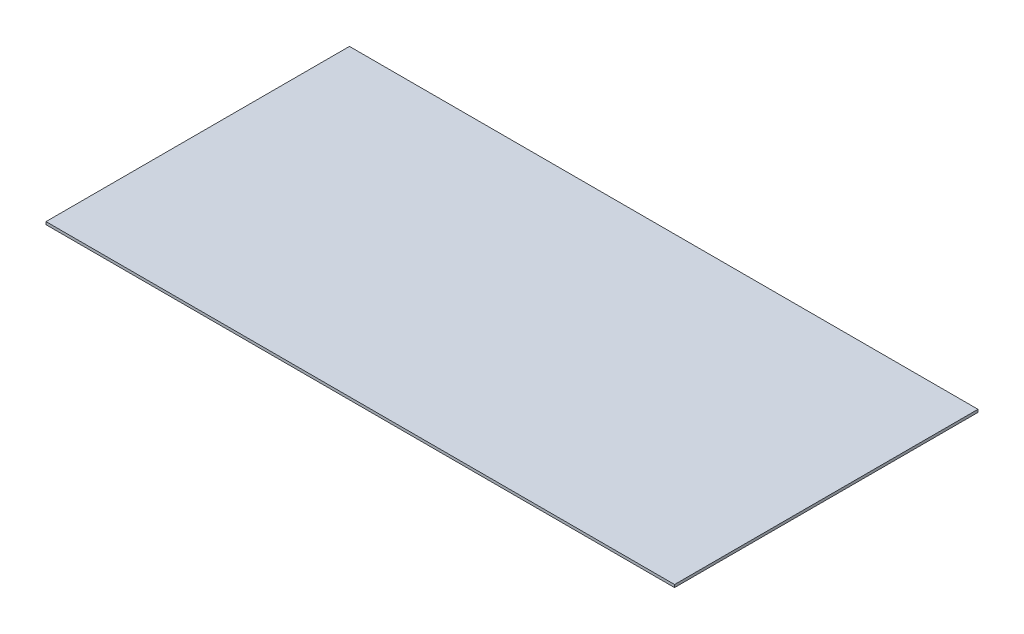
ISO-10303-21;
HEADER;
FILE_DESCRIPTION(('STEP AP214'),'2;1');
FILE_NAME('part.step','',(''),(''),'','','');
FILE_SCHEMA(('AUTOMOTIVE_DESIGN { 1 0 10303 214 1 1 1 1 }'));
ENDSEC;
DATA;
#1=APPLICATION_CONTEXT('core data for automotive mechanical design processes');
#2=APPLICATION_PROTOCOL_DEFINITION('international standard','automotive_design',2000,#1);
#3=PRODUCT_CONTEXT('',#1,'mechanical');
#4=PRODUCT('Part','Part','',(#3));
#5=PRODUCT_RELATED_PRODUCT_CATEGORY('part','',(#4));
#6=PRODUCT_DEFINITION_FORMATION('','',#4);
#7=PRODUCT_DEFINITION_CONTEXT('part definition',#1,'design');
#8=PRODUCT_DEFINITION('design','',#6,#7);
#9=PRODUCT_DEFINITION_SHAPE('','',#8);
#10=(LENGTH_UNIT() NAMED_UNIT(*) SI_UNIT(.MILLI.,.METRE.));
#11=(NAMED_UNIT(*) PLANE_ANGLE_UNIT() SI_UNIT($,.RADIAN.));
#12=(NAMED_UNIT(*) SI_UNIT($,.STERADIAN.) SOLID_ANGLE_UNIT());
#13=UNCERTAINTY_MEASURE_WITH_UNIT(LENGTH_MEASURE(1.E-05),#10,'distance_accuracy_value','');
#14=(GEOMETRIC_REPRESENTATION_CONTEXT(3) GLOBAL_UNCERTAINTY_ASSIGNED_CONTEXT((#13)) GLOBAL_UNIT_ASSIGNED_CONTEXT((#10,
#11,#12)) REPRESENTATION_CONTEXT('',''));
#15=CARTESIAN_POINT('',(0.,0.,0.));
#16=DIRECTION('',(0.,0.,1.));
#17=DIRECTION('',(1.,0.,0.));
#18=AXIS2_PLACEMENT_3D('',#15,#16,#17);
#19=CARTESIAN_POINT('',(0.,3.175,0.));
#20=DIRECTION('',(1.,0.,0.));
#21=DIRECTION('',(0.,0.,-1.));
#22=AXIS2_PLACEMENT_3D('',#19,#20,#21);
#23=PLANE('',#22);
#24=DIRECTION('',(0.,0.,1.));
#25=VECTOR('',#24,1.);
#26=CARTESIAN_POINT('',(0.,0.,0.));
#27=LINE('',#26,#25);
#28=CARTESIAN_POINT('',(0.,0.,-355.6));
#29=VERTEX_POINT('',#28);
#30=CARTESIAN_POINT('',(0.,0.,0.));
#31=VERTEX_POINT('',#30);
#32=EDGE_CURVE('E96',#29,#31,#27,.T.);
#33=ORIENTED_EDGE('',*,*,#32,.T.);
#34=DIRECTION('',(0.,-1.,0.));
#35=VECTOR('',#34,1.);
#36=CARTESIAN_POINT('',(0.,3.175,0.));
#37=LINE('',#36,#35);
#38=CARTESIAN_POINT('',(0.,3.175,0.));
#39=VERTEX_POINT('',#38);
#40=EDGE_CURVE('E11',#39,#31,#37,.T.);
#41=ORIENTED_EDGE('',*,*,#40,.F.);
#42=DIRECTION('',(0.,0.,1.));
#43=VECTOR('',#42,1.);
#44=CARTESIAN_POINT('',(0.,3.175,0.));
#45=LINE('',#44,#43);
#46=CARTESIAN_POINT('',(0.,3.175,-355.6));
#47=VERTEX_POINT('',#46);
#48=EDGE_CURVE('E84',#47,#39,#45,.T.);
#49=ORIENTED_EDGE('',*,*,#48,.F.);
#50=DIRECTION('',(0.,-1.,0.));
#51=VECTOR('',#50,1.);
#52=CARTESIAN_POINT('',(0.,3.175,-355.6));
#53=LINE('',#52,#51);
#54=EDGE_CURVE('E92',#47,#29,#53,.T.);
#55=ORIENTED_EDGE('',*,*,#54,.T.);
#56=EDGE_LOOP('',(#33,#41,#49,#55));
#57=FACE_BOUND('',#56,.T.);
#58=ADVANCED_FACE('F33',(#57),#23,.F.);
#59=CARTESIAN_POINT('',(0.,3.175,0.));
#60=DIRECTION('',(0.,0.,-1.));
#61=DIRECTION('',(-1.,0.,0.));
#62=AXIS2_PLACEMENT_3D('',#59,#60,#61);
#63=PLANE('',#62);
#64=DIRECTION('',(1.,0.,0.));
#65=VECTOR('',#64,1.);
#66=CARTESIAN_POINT('',(0.,0.,0.));
#67=LINE('',#66,#65);
#68=CARTESIAN_POINT('',(736.6,0.,0.));
#69=VERTEX_POINT('',#68);
#70=EDGE_CURVE('E88',#31,#69,#67,.T.);
#71=ORIENTED_EDGE('',*,*,#70,.T.);
#72=DIRECTION('',(0.,-1.,0.));
#73=VECTOR('',#72,1.);
#74=CARTESIAN_POINT('',(736.6,3.175,0.));
#75=LINE('',#74,#73);
#76=CARTESIAN_POINT('',(736.6,3.175,0.));
#77=VERTEX_POINT('',#76);
#78=EDGE_CURVE('E41',#77,#69,#75,.T.);
#79=ORIENTED_EDGE('',*,*,#78,.F.);
#80=DIRECTION('',(1.,0.,0.));
#81=VECTOR('',#80,1.);
#82=CARTESIAN_POINT('',(0.,3.175,0.));
#83=LINE('',#82,#81);
#84=EDGE_CURVE('E79',#39,#77,#83,.T.);
#85=ORIENTED_EDGE('',*,*,#84,.F.);
#86=ORIENTED_EDGE('',*,*,#40,.T.);
#87=EDGE_LOOP('',(#71,#79,#85,#86));
#88=FACE_BOUND('',#87,.T.);
#89=ADVANCED_FACE('F87',(#88),#63,.F.);
#90=CARTESIAN_POINT('',(736.6,3.175,0.));
#91=DIRECTION('',(-1.,0.,0.));
#92=DIRECTION('',(0.,0.,1.));
#93=AXIS2_PLACEMENT_3D('',#90,#91,#92);
#94=PLANE('',#93);
#95=DIRECTION('',(0.,0.,-1.));
#96=VECTOR('',#95,1.);
#97=CARTESIAN_POINT('',(736.6,0.,0.));
#98=LINE('',#97,#96);
#99=CARTESIAN_POINT('',(736.6,0.,-355.6));
#100=VERTEX_POINT('',#99);
#101=EDGE_CURVE('E66',#69,#100,#98,.T.);
#102=ORIENTED_EDGE('',*,*,#101,.T.);
#103=DIRECTION('',(0.,-1.,0.));
#104=VECTOR('',#103,1.);
#105=CARTESIAN_POINT('',(736.6,3.175,-355.6));
#106=LINE('',#105,#104);
#107=CARTESIAN_POINT('',(736.6,3.175,-355.6));
#108=VERTEX_POINT('',#107);
#109=EDGE_CURVE('E89',#108,#100,#106,.T.);
#110=ORIENTED_EDGE('',*,*,#109,.F.);
#111=DIRECTION('',(0.,0.,-1.));
#112=VECTOR('',#111,1.);
#113=CARTESIAN_POINT('',(736.6,3.175,0.));
#114=LINE('',#113,#112);
#115=EDGE_CURVE('E82',#77,#108,#114,.T.);
#116=ORIENTED_EDGE('',*,*,#115,.F.);
#117=ORIENTED_EDGE('',*,*,#78,.T.);
#118=EDGE_LOOP('',(#102,#110,#116,#117));
#119=FACE_BOUND('',#118,.T.);
#120=ADVANCED_FACE('F90',(#119),#94,.F.);
#121=CARTESIAN_POINT('',(0.,3.175,-355.6));
#122=DIRECTION('',(0.,0.,1.));
#123=DIRECTION('',(1.,0.,0.));
#124=AXIS2_PLACEMENT_3D('',#121,#122,#123);
#125=PLANE('',#124);
#126=DIRECTION('',(-1.,0.,0.));
#127=VECTOR('',#126,1.);
#128=CARTESIAN_POINT('',(0.,0.,-355.6));
#129=LINE('',#128,#127);
#130=EDGE_CURVE('E72',#100,#29,#129,.T.);
#131=ORIENTED_EDGE('',*,*,#130,.T.);
#132=ORIENTED_EDGE('',*,*,#54,.F.);
#133=DIRECTION('',(-1.,0.,0.));
#134=VECTOR('',#133,1.);
#135=CARTESIAN_POINT('',(0.,3.175,-355.6));
#136=LINE('',#135,#134);
#137=EDGE_CURVE('E49',#108,#47,#136,.T.);
#138=ORIENTED_EDGE('',*,*,#137,.F.);
#139=ORIENTED_EDGE('',*,*,#109,.T.);
#140=EDGE_LOOP('',(#131,#132,#138,#139));
#141=FACE_BOUND('',#140,.T.);
#142=ADVANCED_FACE('F103',(#141),#125,.F.);
#143=CARTESIAN_POINT('',(0.,3.175,0.));
#144=DIRECTION('',(0.,-1.,0.));
#145=DIRECTION('',(0.,0.,-1.));
#146=AXIS2_PLACEMENT_3D('',#143,#144,#145);
#147=PLANE('',#146);
#148=ORIENTED_EDGE('',*,*,#48,.T.);
#149=ORIENTED_EDGE('',*,*,#84,.T.);
#150=ORIENTED_EDGE('',*,*,#115,.T.);
#151=ORIENTED_EDGE('',*,*,#137,.T.);
#152=EDGE_LOOP('',(#148,#149,#150,#151));
#153=FACE_BOUND('',#152,.T.);
#154=ADVANCED_FACE('F80',(#153),#147,.F.);
#155=CARTESIAN_POINT('',(0.,0.,0.));
#156=DIRECTION('',(0.,-1.,0.));
#157=DIRECTION('',(0.,0.,-1.));
#158=AXIS2_PLACEMENT_3D('',#155,#156,#157);
#159=PLANE('',#158);
#160=ORIENTED_EDGE('',*,*,#32,.F.);
#161=ORIENTED_EDGE('',*,*,#130,.F.);
#162=ORIENTED_EDGE('',*,*,#101,.F.);
#163=ORIENTED_EDGE('',*,*,#70,.F.);
#164=EDGE_LOOP('',(#160,#161,#162,#163));
#165=FACE_BOUND('',#164,.T.);
#166=ADVANCED_FACE('F106',(#165),#159,.T.);
#167=CLOSED_SHELL('',(#58,#89,#120,#142,#154,#166));
#168=MANIFOLD_SOLID_BREP('B2',#167);
#169=ADVANCED_BREP_SHAPE_REPRESENTATION('',(#18,#168),#14);
#170=SHAPE_DEFINITION_REPRESENTATION(#9,#169);
ENDSEC;
END-ISO-10303-21;
